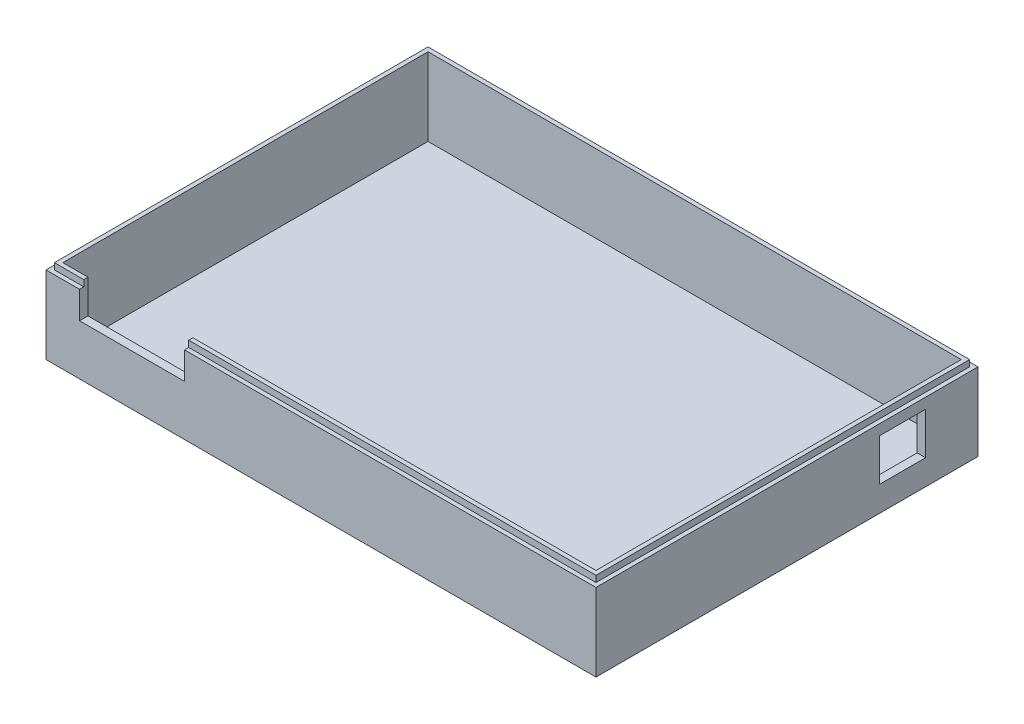
ISO-10303-21;
HEADER;
FILE_DESCRIPTION(('STEP AP214'),'2;1');
FILE_NAME('part.step','',(''),(''),'','','');
FILE_SCHEMA(('AUTOMOTIVE_DESIGN { 1 0 10303 214 1 1 1 1 }'));
ENDSEC;
DATA;
#1=APPLICATION_CONTEXT('core data for automotive mechanical design processes');
#2=APPLICATION_PROTOCOL_DEFINITION('international standard','automotive_design',2000,#1);
#3=PRODUCT_CONTEXT('',#1,'mechanical');
#4=PRODUCT('Part','Part','',(#3));
#5=PRODUCT_RELATED_PRODUCT_CATEGORY('part','',(#4));
#6=PRODUCT_DEFINITION_FORMATION('','',#4);
#7=PRODUCT_DEFINITION_CONTEXT('part definition',#1,'design');
#8=PRODUCT_DEFINITION('design','',#6,#7);
#9=PRODUCT_DEFINITION_SHAPE('','',#8);
#10=(LENGTH_UNIT() NAMED_UNIT(*) SI_UNIT(.MILLI.,.METRE.));
#11=(NAMED_UNIT(*) PLANE_ANGLE_UNIT() SI_UNIT($,.RADIAN.));
#12=(NAMED_UNIT(*) SI_UNIT($,.STERADIAN.) SOLID_ANGLE_UNIT());
#13=UNCERTAINTY_MEASURE_WITH_UNIT(LENGTH_MEASURE(1.E-05),#10,'distance_accuracy_value','');
#14=(GEOMETRIC_REPRESENTATION_CONTEXT(3) GLOBAL_UNCERTAINTY_ASSIGNED_CONTEXT((#13)) GLOBAL_UNIT_ASSIGNED_CONTEXT((#10,
#11,#12)) REPRESENTATION_CONTEXT('',''));
#15=CARTESIAN_POINT('',(0.,0.,0.));
#16=DIRECTION('',(0.,0.,1.));
#17=DIRECTION('',(1.,0.,0.));
#18=AXIS2_PLACEMENT_3D('',#15,#16,#17);
#19=CARTESIAN_POINT('',(65.5,20.,-45.5));
#20=DIRECTION('',(0.,0.,1.));
#21=DIRECTION('',(1.,0.,0.));
#22=AXIS2_PLACEMENT_3D('',#19,#20,#21);
#23=PLANE('',#22);
#24=DIRECTION('',(-1.,0.,0.));
#25=VECTOR('',#24,1.);
#26=CARTESIAN_POINT('',(65.5,18.5,-45.5));
#27=LINE('',#26,#25);
#28=CARTESIAN_POINT('',(65.5,18.5,-45.5));
#29=VERTEX_POINT('',#28);
#30=CARTESIAN_POINT('',(-65.5,18.5,-45.5));
#31=VERTEX_POINT('',#30);
#32=EDGE_CURVE('E359',#29,#31,#27,.T.);
#33=ORIENTED_EDGE('',*,*,#32,.F.);
#34=DIRECTION('',(0.,-1.,0.));
#35=VECTOR('',#34,1.);
#36=CARTESIAN_POINT('',(65.5,20.,-45.5));
#37=LINE('',#36,#35);
#38=CARTESIAN_POINT('',(65.5,0.,-45.5));
#39=VERTEX_POINT('',#38);
#40=EDGE_CURVE('E258',#29,#39,#37,.T.);
#41=ORIENTED_EDGE('',*,*,#40,.T.);
#42=DIRECTION('',(-1.,0.,0.));
#43=VECTOR('',#42,1.);
#44=CARTESIAN_POINT('',(65.5,0.,-45.5));
#45=LINE('',#44,#43);
#46=CARTESIAN_POINT('',(-65.5,0.,-45.5));
#47=VERTEX_POINT('',#46);
#48=EDGE_CURVE('E246',#39,#47,#45,.T.);
#49=ORIENTED_EDGE('',*,*,#48,.T.);
#50=DIRECTION('',(0.,-1.,0.));
#51=VECTOR('',#50,1.);
#52=CARTESIAN_POINT('',(-65.5,20.,-45.5));
#53=LINE('',#52,#51);
#54=EDGE_CURVE('E264',#31,#47,#53,.T.);
#55=ORIENTED_EDGE('',*,*,#54,.F.);
#56=EDGE_LOOP('',(#33,#41,#49,#55));
#57=FACE_BOUND('',#56,.T.);
#58=ADVANCED_FACE('F33',(#57),#23,.F.);
#59=CARTESIAN_POINT('',(-65.5,20.,-45.5));
#60=DIRECTION('',(1.,0.,0.));
#61=DIRECTION('',(0.,0.,-1.));
#62=AXIS2_PLACEMENT_3D('',#59,#60,#61);
#63=PLANE('',#62);
#64=DIRECTION('',(0.,0.,1.));
#65=VECTOR('',#64,1.);
#66=CARTESIAN_POINT('',(-65.5,18.5,-45.5));
#67=LINE('',#66,#65);
#68=CARTESIAN_POINT('',(-65.5,18.5,45.5));
#69=VERTEX_POINT('',#68);
#70=EDGE_CURVE('E189',#31,#69,#67,.T.);
#71=ORIENTED_EDGE('',*,*,#70,.F.);
#72=ORIENTED_EDGE('',*,*,#54,.T.);
#73=DIRECTION('',(0.,0.,1.));
#74=VECTOR('',#73,1.);
#75=CARTESIAN_POINT('',(-65.5,0.,-45.5));
#76=LINE('',#75,#74);
#77=CARTESIAN_POINT('',(-65.5,0.,45.5));
#78=VERTEX_POINT('',#77);
#79=EDGE_CURVE('E249',#47,#78,#76,.T.);
#80=ORIENTED_EDGE('',*,*,#79,.T.);
#81=DIRECTION('',(0.,-1.,0.));
#82=VECTOR('',#81,1.);
#83=CARTESIAN_POINT('',(-65.5,20.,45.5));
#84=LINE('',#83,#82);
#85=EDGE_CURVE('E262',#69,#78,#84,.T.);
#86=ORIENTED_EDGE('',*,*,#85,.F.);
#87=EDGE_LOOP('',(#71,#72,#80,#86));
#88=FACE_BOUND('',#87,.T.);
#89=ADVANCED_FACE('F408',(#88),#63,.F.);
#90=CARTESIAN_POINT('',(-65.5,20.,45.5));
#91=DIRECTION('',(0.,0.,-1.));
#92=DIRECTION('',(-1.,0.,0.));
#93=AXIS2_PLACEMENT_3D('',#90,#91,#92);
#94=PLANE('',#93);
#95=DIRECTION('',(1.,0.,0.));
#96=VECTOR('',#95,1.);
#97=CARTESIAN_POINT('',(-65.5,18.5,45.5));
#98=LINE('',#97,#96);
#99=CARTESIAN_POINT('',(-57.5,18.5,45.5));
#100=VERTEX_POINT('',#99);
#101=EDGE_CURVE('E182',#69,#100,#98,.T.);
#102=ORIENTED_EDGE('',*,*,#101,.F.);
#103=ORIENTED_EDGE('',*,*,#85,.T.);
#104=DIRECTION('',(1.,0.,0.));
#105=VECTOR('',#104,1.);
#106=CARTESIAN_POINT('',(-65.5,0.,45.5));
#107=LINE('',#106,#105);
#108=CARTESIAN_POINT('',(65.5,0.,45.5));
#109=VERTEX_POINT('',#108);
#110=EDGE_CURVE('E252',#78,#109,#107,.T.);
#111=ORIENTED_EDGE('',*,*,#110,.T.);
#112=DIRECTION('',(0.,-1.,0.));
#113=VECTOR('',#112,1.);
#114=CARTESIAN_POINT('',(65.5,20.,45.5));
#115=LINE('',#114,#113);
#116=CARTESIAN_POINT('',(65.5,18.5,45.5));
#117=VERTEX_POINT('',#116);
#118=EDGE_CURVE('E260',#117,#109,#115,.T.);
#119=ORIENTED_EDGE('',*,*,#118,.F.);
#120=DIRECTION('',(1.,0.,0.));
#121=VECTOR('',#120,1.);
#122=CARTESIAN_POINT('',(-32.5,18.5,45.5));
#123=LINE('',#122,#121);
#124=CARTESIAN_POINT('',(-32.5,18.5,45.5));
#125=VERTEX_POINT('',#124);
#126=EDGE_CURVE('E363',#125,#117,#123,.T.);
#127=ORIENTED_EDGE('',*,*,#126,.F.);
#128=DIRECTION('',(0.,1.,0.));
#129=VECTOR('',#128,1.);
#130=CARTESIAN_POINT('',(-32.5,22.,45.5));
#131=LINE('',#130,#129);
#132=CARTESIAN_POINT('',(-32.5,12.,45.5));
#133=VERTEX_POINT('',#132);
#134=EDGE_CURVE('E208',#133,#125,#131,.T.);
#135=ORIENTED_EDGE('',*,*,#134,.F.);
#136=DIRECTION('',(1.,0.,0.));
#137=VECTOR('',#136,1.);
#138=CARTESIAN_POINT('',(-57.5,12.,45.5));
#139=LINE('',#138,#137);
#140=CARTESIAN_POINT('',(-57.5,12.,45.5));
#141=VERTEX_POINT('',#140);
#142=EDGE_CURVE('E207',#141,#133,#139,.T.);
#143=ORIENTED_EDGE('',*,*,#142,.F.);
#144=DIRECTION('',(0.,-1.,0.));
#145=VECTOR('',#144,1.);
#146=CARTESIAN_POINT('',(-57.5,22.,45.5));
#147=LINE('',#146,#145);
#148=EDGE_CURVE('E199',#100,#141,#147,.T.);
#149=ORIENTED_EDGE('',*,*,#148,.F.);
#150=EDGE_LOOP('',(#102,#103,#111,#119,#127,#135,#143,#149));
#151=FACE_BOUND('',#150,.T.);
#152=ADVANCED_FACE('F205',(#151),#94,.F.);
#153=CARTESIAN_POINT('',(65.5,20.,45.5));
#154=DIRECTION('',(-1.,0.,0.));
#155=DIRECTION('',(0.,0.,1.));
#156=AXIS2_PLACEMENT_3D('',#153,#154,#155);
#157=PLANE('',#156);
#158=DIRECTION('',(0.,0.,1.));
#159=VECTOR('',#158,1.);
#160=CARTESIAN_POINT('',(65.5,16.,-22.));
#161=LINE('',#160,#159);
#162=CARTESIAN_POINT('',(65.5,16.,-33.));
#163=VERTEX_POINT('',#162);
#164=CARTESIAN_POINT('',(65.5,16.,-22.));
#165=VERTEX_POINT('',#164);
#166=EDGE_CURVE('E327',#163,#165,#161,.T.);
#167=ORIENTED_EDGE('',*,*,#166,.F.);
#168=DIRECTION('',(0.,1.,0.));
#169=VECTOR('',#168,1.);
#170=CARTESIAN_POINT('',(65.5,6.,-33.));
#171=LINE('',#170,#169);
#172=CARTESIAN_POINT('',(65.5,6.,-33.));
#173=VERTEX_POINT('',#172);
#174=EDGE_CURVE('E312',#173,#163,#171,.T.);
#175=ORIENTED_EDGE('',*,*,#174,.F.);
#176=DIRECTION('',(0.,0.,-1.));
#177=VECTOR('',#176,1.);
#178=CARTESIAN_POINT('',(65.5,6.,-22.));
#179=LINE('',#178,#177);
#180=CARTESIAN_POINT('',(65.5,6.,-22.));
#181=VERTEX_POINT('',#180);
#182=EDGE_CURVE('E294',#181,#173,#179,.T.);
#183=ORIENTED_EDGE('',*,*,#182,.F.);
#184=DIRECTION('',(0.,-1.,0.));
#185=VECTOR('',#184,1.);
#186=CARTESIAN_POINT('',(65.5,6.,-22.));
#187=LINE('',#186,#185);
#188=EDGE_CURVE('E329',#165,#181,#187,.T.);
#189=ORIENTED_EDGE('',*,*,#188,.F.);
#190=EDGE_LOOP('',(#167,#175,#183,#189));
#191=FACE_BOUND('',#190,.T.);
#192=DIRECTION('',(0.,0.,-1.));
#193=VECTOR('',#192,1.);
#194=CARTESIAN_POINT('',(65.5,18.5,45.5));
#195=LINE('',#194,#193);
#196=EDGE_CURVE('E361',#117,#29,#195,.T.);
#197=ORIENTED_EDGE('',*,*,#196,.F.);
#198=ORIENTED_EDGE('',*,*,#118,.T.);
#199=DIRECTION('',(0.,0.,-1.));
#200=VECTOR('',#199,1.);
#201=CARTESIAN_POINT('',(65.5,0.,45.5));
#202=LINE('',#201,#200);
#203=EDGE_CURVE('E255',#109,#39,#202,.T.);
#204=ORIENTED_EDGE('',*,*,#203,.T.);
#205=ORIENTED_EDGE('',*,*,#40,.F.);
#206=EDGE_LOOP('',(#197,#198,#204,#205));
#207=FACE_BOUND('',#206,.T.);
#208=ADVANCED_FACE('F400',(#191,#207),#157,.F.);
#209=CARTESIAN_POINT('',(0.,1.5,0.));
#210=DIRECTION('',(0.,-1.,0.));
#211=DIRECTION('',(0.,0.,-1.));
#212=AXIS2_PLACEMENT_3D('',#209,#210,#211);
#213=PLANE('',#212);
#214=DIRECTION('',(0.,0.,-1.));
#215=VECTOR('',#214,1.);
#216=CARTESIAN_POINT('',(63.5,1.5,43.5));
#217=LINE('',#216,#215);
#218=CARTESIAN_POINT('',(63.5,1.5,43.5));
#219=VERTEX_POINT('',#218);
#220=CARTESIAN_POINT('',(63.5,1.5,-43.5));
#221=VERTEX_POINT('',#220);
#222=EDGE_CURVE('E266',#219,#221,#217,.T.);
#223=ORIENTED_EDGE('',*,*,#222,.T.);
#224=DIRECTION('',(-1.,0.,0.));
#225=VECTOR('',#224,1.);
#226=CARTESIAN_POINT('',(-63.5,1.5,-43.5));
#227=LINE('',#226,#225);
#228=CARTESIAN_POINT('',(-63.5,1.5,-43.5));
#229=VERTEX_POINT('',#228);
#230=EDGE_CURVE('E269',#221,#229,#227,.T.);
#231=ORIENTED_EDGE('',*,*,#230,.T.);
#232=DIRECTION('',(0.,0.,1.));
#233=VECTOR('',#232,1.);
#234=CARTESIAN_POINT('',(-63.5,1.5,43.5));
#235=LINE('',#234,#233);
#236=CARTESIAN_POINT('',(-63.5,1.5,43.5));
#237=VERTEX_POINT('',#236);
#238=EDGE_CURVE('E41',#229,#237,#235,.T.);
#239=ORIENTED_EDGE('',*,*,#238,.T.);
#240=DIRECTION('',(1.,0.,0.));
#241=VECTOR('',#240,1.);
#242=CARTESIAN_POINT('',(-63.5,1.5,43.5));
#243=LINE('',#242,#241);
#244=EDGE_CURVE('E11',#237,#219,#243,.T.);
#245=ORIENTED_EDGE('',*,*,#244,.T.);
#246=EDGE_LOOP('',(#223,#231,#239,#245));
#247=FACE_BOUND('',#246,.T.);
#248=ADVANCED_FACE('F274',(#247),#213,.F.);
#249=CARTESIAN_POINT('',(-63.5,20.,-43.5));
#250=DIRECTION('',(1.,0.,0.));
#251=DIRECTION('',(0.,0.,-1.));
#252=AXIS2_PLACEMENT_3D('',#249,#250,#251);
#253=PLANE('',#252);
#254=ORIENTED_EDGE('',*,*,#238,.F.);
#255=DIRECTION('',(0.,-1.,0.));
#256=VECTOR('',#255,1.);
#257=CARTESIAN_POINT('',(-63.5,20.,-43.5));
#258=LINE('',#257,#256);
#259=CARTESIAN_POINT('',(-63.5,20.,-43.5));
#260=VERTEX_POINT('',#259);
#261=EDGE_CURVE('E235',#260,#229,#258,.T.);
#262=ORIENTED_EDGE('',*,*,#261,.F.);
#263=DIRECTION('',(0.,0.,1.));
#264=VECTOR('',#263,1.);
#265=CARTESIAN_POINT('',(-63.5,20.,-43.5));
#266=LINE('',#265,#264);
#267=CARTESIAN_POINT('',(-63.5,20.,43.5));
#268=VERTEX_POINT('',#267);
#269=EDGE_CURVE('E224',#260,#268,#266,.T.);
#270=ORIENTED_EDGE('',*,*,#269,.T.);
#271=DIRECTION('',(0.,-1.,0.));
#272=VECTOR('',#271,1.);
#273=CARTESIAN_POINT('',(-63.5,20.,43.5));
#274=LINE('',#273,#272);
#275=EDGE_CURVE('E243',#268,#237,#274,.T.);
#276=ORIENTED_EDGE('',*,*,#275,.T.);
#277=EDGE_LOOP('',(#254,#262,#270,#276));
#278=FACE_BOUND('',#277,.T.);
#279=ADVANCED_FACE('F277',(#278),#253,.T.);
#280=CARTESIAN_POINT('',(-63.5,20.,43.5));
#281=DIRECTION('',(0.,0.,-1.));
#282=DIRECTION('',(-1.,0.,0.));
#283=AXIS2_PLACEMENT_3D('',#280,#281,#282);
#284=PLANE('',#283);
#285=DIRECTION('',(0.,-1.,0.));
#286=VECTOR('',#285,1.);
#287=CARTESIAN_POINT('',(-57.5,22.,43.5));
#288=LINE('',#287,#286);
#289=CARTESIAN_POINT('',(-57.5,20.,43.5));
#290=VERTEX_POINT('',#289);
#291=CARTESIAN_POINT('',(-57.5,12.,43.5));
#292=VERTEX_POINT('',#291);
#293=EDGE_CURVE('E220',#290,#292,#288,.T.);
#294=ORIENTED_EDGE('',*,*,#293,.T.);
#295=DIRECTION('',(1.,0.,0.));
#296=VECTOR('',#295,1.);
#297=CARTESIAN_POINT('',(-57.5,12.,43.5));
#298=LINE('',#297,#296);
#299=CARTESIAN_POINT('',(-32.5,12.,43.5));
#300=VERTEX_POINT('',#299);
#301=EDGE_CURVE('E298',#292,#300,#298,.T.);
#302=ORIENTED_EDGE('',*,*,#301,.T.);
#303=DIRECTION('',(0.,1.,0.));
#304=VECTOR('',#303,1.);
#305=CARTESIAN_POINT('',(-32.5,22.,43.5));
#306=LINE('',#305,#304);
#307=CARTESIAN_POINT('',(-32.5,20.,43.5));
#308=VERTEX_POINT('',#307);
#309=EDGE_CURVE('E213',#300,#308,#306,.T.);
#310=ORIENTED_EDGE('',*,*,#309,.T.);
#311=DIRECTION('',(1.,0.,0.));
#312=VECTOR('',#311,1.);
#313=CARTESIAN_POINT('',(-63.5,20.,43.5));
#314=LINE('',#313,#312);
#315=CARTESIAN_POINT('',(63.5,20.,43.5));
#316=VERTEX_POINT('',#315);
#317=EDGE_CURVE('E226',#308,#316,#314,.T.);
#318=ORIENTED_EDGE('',*,*,#317,.T.);
#319=DIRECTION('',(0.,-1.,0.));
#320=VECTOR('',#319,1.);
#321=CARTESIAN_POINT('',(63.5,20.,43.5));
#322=LINE('',#321,#320);
#323=EDGE_CURVE('E240',#316,#219,#322,.T.);
#324=ORIENTED_EDGE('',*,*,#323,.T.);
#325=ORIENTED_EDGE('',*,*,#244,.F.);
#326=ORIENTED_EDGE('',*,*,#275,.F.);
#327=EDGE_CURVE('E227',#268,#290,#314,.T.);
#328=ORIENTED_EDGE('',*,*,#327,.T.);
#329=EDGE_LOOP('',(#294,#302,#310,#318,#324,#325,#326,#328));
#330=FACE_BOUND('',#329,.T.);
#331=ADVANCED_FACE('F282',(#330),#284,.T.);
#332=CARTESIAN_POINT('',(63.5,20.,43.5));
#333=DIRECTION('',(-1.,0.,0.));
#334=DIRECTION('',(0.,0.,1.));
#335=AXIS2_PLACEMENT_3D('',#332,#333,#334);
#336=PLANE('',#335);
#337=DIRECTION('',(0.,1.,0.));
#338=VECTOR('',#337,1.);
#339=CARTESIAN_POINT('',(63.5,6.,-33.));
#340=LINE('',#339,#338);
#341=CARTESIAN_POINT('',(63.5,6.,-33.));
#342=VERTEX_POINT('',#341);
#343=CARTESIAN_POINT('',(63.5,16.,-33.));
#344=VERTEX_POINT('',#343);
#345=EDGE_CURVE('E310',#342,#344,#340,.T.);
#346=ORIENTED_EDGE('',*,*,#345,.T.);
#347=DIRECTION('',(0.,0.,1.));
#348=VECTOR('',#347,1.);
#349=CARTESIAN_POINT('',(63.5,16.,-22.));
#350=LINE('',#349,#348);
#351=CARTESIAN_POINT('',(63.5,16.,-22.));
#352=VERTEX_POINT('',#351);
#353=EDGE_CURVE('E313',#344,#352,#350,.T.);
#354=ORIENTED_EDGE('',*,*,#353,.T.);
#355=DIRECTION('',(0.,-1.,0.));
#356=VECTOR('',#355,1.);
#357=CARTESIAN_POINT('',(63.5,6.,-22.));
#358=LINE('',#357,#356);
#359=CARTESIAN_POINT('',(63.5,6.,-22.));
#360=VERTEX_POINT('',#359);
#361=EDGE_CURVE('E316',#352,#360,#358,.T.);
#362=ORIENTED_EDGE('',*,*,#361,.T.);
#363=DIRECTION('',(0.,0.,-1.));
#364=VECTOR('',#363,1.);
#365=CARTESIAN_POINT('',(63.5,6.,-22.));
#366=LINE('',#365,#364);
#367=EDGE_CURVE('E309',#360,#342,#366,.T.);
#368=ORIENTED_EDGE('',*,*,#367,.T.);
#369=EDGE_LOOP('',(#346,#354,#362,#368));
#370=FACE_BOUND('',#369,.T.);
#371=ORIENTED_EDGE('',*,*,#222,.F.);
#372=ORIENTED_EDGE('',*,*,#323,.F.);
#373=DIRECTION('',(0.,0.,-1.));
#374=VECTOR('',#373,1.);
#375=CARTESIAN_POINT('',(63.5,20.,43.5));
#376=LINE('',#375,#374);
#377=CARTESIAN_POINT('',(63.5,20.,-43.5));
#378=VERTEX_POINT('',#377);
#379=EDGE_CURVE('E230',#316,#378,#376,.T.);
#380=ORIENTED_EDGE('',*,*,#379,.T.);
#381=DIRECTION('',(0.,-1.,0.));
#382=VECTOR('',#381,1.);
#383=CARTESIAN_POINT('',(63.5,20.,-43.5));
#384=LINE('',#383,#382);
#385=EDGE_CURVE('E237',#378,#221,#384,.T.);
#386=ORIENTED_EDGE('',*,*,#385,.T.);
#387=EDGE_LOOP('',(#371,#372,#380,#386));
#388=FACE_BOUND('',#387,.T.);
#389=ADVANCED_FACE('F441',(#370,#388),#336,.T.);
#390=CARTESIAN_POINT('',(63.5,20.,-43.5));
#391=DIRECTION('',(0.,0.,1.));
#392=DIRECTION('',(1.,0.,0.));
#393=AXIS2_PLACEMENT_3D('',#390,#391,#392);
#394=PLANE('',#393);
#395=ORIENTED_EDGE('',*,*,#230,.F.);
#396=ORIENTED_EDGE('',*,*,#385,.F.);
#397=DIRECTION('',(-1.,0.,0.));
#398=VECTOR('',#397,1.);
#399=CARTESIAN_POINT('',(63.5,20.,-43.5));
#400=LINE('',#399,#398);
#401=EDGE_CURVE('E233',#378,#260,#400,.T.);
#402=ORIENTED_EDGE('',*,*,#401,.T.);
#403=ORIENTED_EDGE('',*,*,#261,.T.);
#404=EDGE_LOOP('',(#395,#396,#402,#403));
#405=FACE_BOUND('',#404,.T.);
#406=ADVANCED_FACE('F417',(#405),#394,.T.);
#407=CARTESIAN_POINT('',(0.,20.,0.));
#408=DIRECTION('',(0.,1.,0.));
#409=DIRECTION('',(0.,0.,1.));
#410=AXIS2_PLACEMENT_3D('',#407,#408,#409);
#411=PLANE('',#410);
#412=DIRECTION('',(-1.,0.,0.));
#413=VECTOR('',#412,1.);
#414=CARTESIAN_POINT('',(64.5,20.,44.5));
#415=LINE('',#414,#413);
#416=CARTESIAN_POINT('',(64.5,20.,44.5));
#417=VERTEX_POINT('',#416);
#418=CARTESIAN_POINT('',(-32.5,20.,44.5));
#419=VERTEX_POINT('',#418);
#420=EDGE_CURVE('E193',#417,#419,#415,.T.);
#421=ORIENTED_EDGE('',*,*,#420,.F.);
#422=DIRECTION('',(0.,0.,1.));
#423=VECTOR('',#422,1.);
#424=CARTESIAN_POINT('',(64.5,20.,-44.5));
#425=LINE('',#424,#423);
#426=CARTESIAN_POINT('',(64.5,20.,-44.5));
#427=VERTEX_POINT('',#426);
#428=EDGE_CURVE('E348',#427,#417,#425,.T.);
#429=ORIENTED_EDGE('',*,*,#428,.F.);
#430=DIRECTION('',(1.,0.,0.));
#431=VECTOR('',#430,1.);
#432=CARTESIAN_POINT('',(-64.5,20.,-44.5));
#433=LINE('',#432,#431);
#434=CARTESIAN_POINT('',(-64.5,20.,-44.5));
#435=VERTEX_POINT('',#434);
#436=EDGE_CURVE('E351',#435,#427,#433,.T.);
#437=ORIENTED_EDGE('',*,*,#436,.F.);
#438=DIRECTION('',(0.,0.,-1.));
#439=VECTOR('',#438,1.);
#440=CARTESIAN_POINT('',(-64.5,20.,44.5));
#441=LINE('',#440,#439);
#442=CARTESIAN_POINT('',(-64.5,20.,44.5));
#443=VERTEX_POINT('',#442);
#444=EDGE_CURVE('E354',#443,#435,#441,.T.);
#445=ORIENTED_EDGE('',*,*,#444,.F.);
#446=DIRECTION('',(-1.,0.,0.));
#447=VECTOR('',#446,1.);
#448=CARTESIAN_POINT('',(-57.5,20.,44.5));
#449=LINE('',#448,#447);
#450=CARTESIAN_POINT('',(-57.5,20.,44.5));
#451=VERTEX_POINT('',#450);
#452=EDGE_CURVE('E292',#451,#443,#449,.T.);
#453=ORIENTED_EDGE('',*,*,#452,.F.);
#454=DIRECTION('',(0.,0.,-1.));
#455=VECTOR('',#454,1.);
#456=CARTESIAN_POINT('',(-57.5,20.,-45.501));
#457=LINE('',#456,#455);
#458=EDGE_CURVE('E288',#451,#290,#457,.T.);
#459=ORIENTED_EDGE('',*,*,#458,.T.);
#460=ORIENTED_EDGE('',*,*,#327,.F.);
#461=ORIENTED_EDGE('',*,*,#269,.F.);
#462=ORIENTED_EDGE('',*,*,#401,.F.);
#463=ORIENTED_EDGE('',*,*,#379,.F.);
#464=ORIENTED_EDGE('',*,*,#317,.F.);
#465=DIRECTION('',(0.,0.,1.));
#466=VECTOR('',#465,1.);
#467=CARTESIAN_POINT('',(-32.5,20.,-45.501));
#468=LINE('',#467,#466);
#469=EDGE_CURVE('E293',#308,#419,#468,.T.);
#470=ORIENTED_EDGE('',*,*,#469,.T.);
#471=EDGE_LOOP('',(#421,#429,#437,#445,#453,#459,#460,#461,#462,#463,#464,#470));
#472=FACE_BOUND('',#471,.T.);
#473=ADVANCED_FACE('F285',(#472),#411,.T.);
#474=CARTESIAN_POINT('',(0.,0.,0.));
#475=DIRECTION('',(0.,-1.,0.));
#476=DIRECTION('',(0.,0.,-1.));
#477=AXIS2_PLACEMENT_3D('',#474,#475,#476);
#478=PLANE('',#477);
#479=ORIENTED_EDGE('',*,*,#48,.F.);
#480=ORIENTED_EDGE('',*,*,#203,.F.);
#481=ORIENTED_EDGE('',*,*,#110,.F.);
#482=ORIENTED_EDGE('',*,*,#79,.F.);
#483=EDGE_LOOP('',(#479,#480,#481,#482));
#484=FACE_BOUND('',#483,.T.);
#485=ADVANCED_FACE('F35',(#484),#478,.T.);
#486=CARTESIAN_POINT('',(-57.5,22.,-45.501));
#487=DIRECTION('',(-1.,0.,0.));
#488=DIRECTION('',(0.,0.,1.));
#489=AXIS2_PLACEMENT_3D('',#486,#487,#488);
#490=PLANE('',#489);
#491=ORIENTED_EDGE('',*,*,#458,.F.);
#492=DIRECTION('',(0.,1.,0.));
#493=VECTOR('',#492,1.);
#494=CARTESIAN_POINT('',(-57.5,18.5,44.5));
#495=LINE('',#494,#493);
#496=CARTESIAN_POINT('',(-57.5,18.5,44.5));
#497=VERTEX_POINT('',#496);
#498=EDGE_CURVE('E201',#497,#451,#495,.T.);
#499=ORIENTED_EDGE('',*,*,#498,.F.);
#500=DIRECTION('',(0.,0.,-1.));
#501=VECTOR('',#500,1.);
#502=CARTESIAN_POINT('',(-57.5,18.5,45.5));
#503=LINE('',#502,#501);
#504=EDGE_CURVE('E186',#100,#497,#503,.T.);
#505=ORIENTED_EDGE('',*,*,#504,.F.);
#506=ORIENTED_EDGE('',*,*,#148,.T.);
#507=DIRECTION('',(0.,0.,1.));
#508=VECTOR('',#507,1.);
#509=CARTESIAN_POINT('',(-57.5,12.,-45.501));
#510=LINE('',#509,#508);
#511=EDGE_CURVE('E210',#292,#141,#510,.T.);
#512=ORIENTED_EDGE('',*,*,#511,.F.);
#513=ORIENTED_EDGE('',*,*,#293,.F.);
#514=EDGE_LOOP('',(#491,#499,#505,#506,#512,#513));
#515=FACE_BOUND('',#514,.T.);
#516=ADVANCED_FACE('F197',(#515),#490,.F.);
#517=CARTESIAN_POINT('',(-57.5,12.,-45.501));
#518=DIRECTION('',(0.,-1.,0.));
#519=DIRECTION('',(0.,0.,-1.));
#520=AXIS2_PLACEMENT_3D('',#517,#518,#519);
#521=PLANE('',#520);
#522=ORIENTED_EDGE('',*,*,#511,.T.);
#523=ORIENTED_EDGE('',*,*,#142,.T.);
#524=DIRECTION('',(0.,0.,1.));
#525=VECTOR('',#524,1.);
#526=CARTESIAN_POINT('',(-32.5,12.,-45.501));
#527=LINE('',#526,#525);
#528=EDGE_CURVE('E217',#300,#133,#527,.T.);
#529=ORIENTED_EDGE('',*,*,#528,.F.);
#530=ORIENTED_EDGE('',*,*,#301,.F.);
#531=EDGE_LOOP('',(#522,#523,#529,#530));
#532=FACE_BOUND('',#531,.T.);
#533=ADVANCED_FACE('F415',(#532),#521,.F.);
#534=CARTESIAN_POINT('',(-32.5,22.,-45.501));
#535=DIRECTION('',(1.,0.,0.));
#536=DIRECTION('',(0.,0.,-1.));
#537=AXIS2_PLACEMENT_3D('',#534,#535,#536);
#538=PLANE('',#537);
#539=DIRECTION('',(0.,0.,1.));
#540=VECTOR('',#539,1.);
#541=CARTESIAN_POINT('',(-32.5,18.5,44.5));
#542=LINE('',#541,#540);
#543=CARTESIAN_POINT('',(-32.5,18.5,44.5));
#544=VERTEX_POINT('',#543);
#545=EDGE_CURVE('E365',#544,#125,#542,.T.);
#546=ORIENTED_EDGE('',*,*,#545,.F.);
#547=DIRECTION('',(0.,1.,0.));
#548=VECTOR('',#547,1.);
#549=CARTESIAN_POINT('',(-32.5,18.5,44.5));
#550=LINE('',#549,#548);
#551=EDGE_CURVE('E325',#544,#419,#550,.T.);
#552=ORIENTED_EDGE('',*,*,#551,.T.);
#553=ORIENTED_EDGE('',*,*,#469,.F.);
#554=ORIENTED_EDGE('',*,*,#309,.F.);
#555=ORIENTED_EDGE('',*,*,#528,.T.);
#556=ORIENTED_EDGE('',*,*,#134,.T.);
#557=EDGE_LOOP('',(#546,#552,#553,#554,#555,#556));
#558=FACE_BOUND('',#557,.T.);
#559=ADVANCED_FACE('F393',(#558),#538,.F.);
#560=CARTESIAN_POINT('',(-65.501,6.,-33.));
#561=DIRECTION('',(0.,0.,-1.));
#562=DIRECTION('',(-1.,0.,0.));
#563=AXIS2_PLACEMENT_3D('',#560,#561,#562);
#564=PLANE('',#563);
#565=DIRECTION('',(1.,0.,0.));
#566=VECTOR('',#565,1.);
#567=CARTESIAN_POINT('',(-65.501,6.,-33.));
#568=LINE('',#567,#566);
#569=EDGE_CURVE('E317',#342,#173,#568,.T.);
#570=ORIENTED_EDGE('',*,*,#569,.T.);
#571=ORIENTED_EDGE('',*,*,#174,.T.);
#572=DIRECTION('',(1.,0.,0.));
#573=VECTOR('',#572,1.);
#574=CARTESIAN_POINT('',(-65.501,16.,-33.));
#575=LINE('',#574,#573);
#576=EDGE_CURVE('E306',#344,#163,#575,.T.);
#577=ORIENTED_EDGE('',*,*,#576,.F.);
#578=ORIENTED_EDGE('',*,*,#345,.F.);
#579=EDGE_LOOP('',(#570,#571,#577,#578));
#580=FACE_BOUND('',#579,.T.);
#581=ADVANCED_FACE('F449',(#580),#564,.F.);
#582=CARTESIAN_POINT('',(-65.501,6.,-22.));
#583=DIRECTION('',(0.,-1.,0.));
#584=DIRECTION('',(0.,0.,-1.));
#585=AXIS2_PLACEMENT_3D('',#582,#583,#584);
#586=PLANE('',#585);
#587=DIRECTION('',(1.,0.,0.));
#588=VECTOR('',#587,1.);
#589=CARTESIAN_POINT('',(-65.501,6.,-22.));
#590=LINE('',#589,#588);
#591=EDGE_CURVE('E314',#360,#181,#590,.T.);
#592=ORIENTED_EDGE('',*,*,#591,.T.);
#593=ORIENTED_EDGE('',*,*,#182,.T.);
#594=ORIENTED_EDGE('',*,*,#569,.F.);
#595=ORIENTED_EDGE('',*,*,#367,.F.);
#596=EDGE_LOOP('',(#592,#593,#594,#595));
#597=FACE_BOUND('',#596,.T.);
#598=ADVANCED_FACE('F455',(#597),#586,.F.);
#599=CARTESIAN_POINT('',(-65.501,6.,-22.));
#600=DIRECTION('',(0.,0.,1.));
#601=DIRECTION('',(1.,0.,0.));
#602=AXIS2_PLACEMENT_3D('',#599,#600,#601);
#603=PLANE('',#602);
#604=DIRECTION('',(1.,0.,0.));
#605=VECTOR('',#604,1.);
#606=CARTESIAN_POINT('',(-65.501,16.,-22.));
#607=LINE('',#606,#605);
#608=EDGE_CURVE('E56',#352,#165,#607,.T.);
#609=ORIENTED_EDGE('',*,*,#608,.T.);
#610=ORIENTED_EDGE('',*,*,#188,.T.);
#611=ORIENTED_EDGE('',*,*,#591,.F.);
#612=ORIENTED_EDGE('',*,*,#361,.F.);
#613=EDGE_LOOP('',(#609,#610,#611,#612));
#614=FACE_BOUND('',#613,.T.);
#615=ADVANCED_FACE('F459',(#614),#603,.F.);
#616=CARTESIAN_POINT('',(-65.501,16.,-22.));
#617=DIRECTION('',(0.,1.,0.));
#618=DIRECTION('',(0.,0.,1.));
#619=AXIS2_PLACEMENT_3D('',#616,#617,#618);
#620=PLANE('',#619);
#621=ORIENTED_EDGE('',*,*,#576,.T.);
#622=ORIENTED_EDGE('',*,*,#166,.T.);
#623=ORIENTED_EDGE('',*,*,#608,.F.);
#624=ORIENTED_EDGE('',*,*,#353,.F.);
#625=EDGE_LOOP('',(#621,#622,#623,#624));
#626=FACE_BOUND('',#625,.T.);
#627=ADVANCED_FACE('F463',(#626),#620,.F.);
#628=CARTESIAN_POINT('',(64.5,18.5,44.5));
#629=DIRECTION('',(0.,0.,-1.));
#630=DIRECTION('',(-1.,0.,0.));
#631=AXIS2_PLACEMENT_3D('',#628,#629,#630);
#632=PLANE('',#631);
#633=ORIENTED_EDGE('',*,*,#420,.T.);
#634=ORIENTED_EDGE('',*,*,#551,.F.);
#635=DIRECTION('',(-1.,0.,0.));
#636=VECTOR('',#635,1.);
#637=CARTESIAN_POINT('',(64.5,18.5,44.5));
#638=LINE('',#637,#636);
#639=CARTESIAN_POINT('',(64.5,18.5,44.5));
#640=VERTEX_POINT('',#639);
#641=EDGE_CURVE('E48',#640,#544,#638,.T.);
#642=ORIENTED_EDGE('',*,*,#641,.F.);
#643=DIRECTION('',(0.,1.,0.));
#644=VECTOR('',#643,1.);
#645=CARTESIAN_POINT('',(64.5,18.5,44.5));
#646=LINE('',#645,#644);
#647=EDGE_CURVE('E343',#640,#417,#646,.T.);
#648=ORIENTED_EDGE('',*,*,#647,.T.);
#649=EDGE_LOOP('',(#633,#634,#642,#648));
#650=FACE_BOUND('',#649,.T.);
#651=ADVANCED_FACE('F390',(#650),#632,.F.);
#652=CARTESIAN_POINT('',(64.5,18.5,-44.5));
#653=DIRECTION('',(-1.,0.,0.));
#654=DIRECTION('',(0.,0.,1.));
#655=AXIS2_PLACEMENT_3D('',#652,#653,#654);
#656=PLANE('',#655);
#657=ORIENTED_EDGE('',*,*,#428,.T.);
#658=ORIENTED_EDGE('',*,*,#647,.F.);
#659=DIRECTION('',(0.,0.,1.));
#660=VECTOR('',#659,1.);
#661=CARTESIAN_POINT('',(64.5,18.5,-44.5));
#662=LINE('',#661,#660);
#663=CARTESIAN_POINT('',(64.5,18.5,-44.5));
#664=VERTEX_POINT('',#663);
#665=EDGE_CURVE('E368',#664,#640,#662,.T.);
#666=ORIENTED_EDGE('',*,*,#665,.F.);
#667=DIRECTION('',(0.,1.,0.));
#668=VECTOR('',#667,1.);
#669=CARTESIAN_POINT('',(64.5,18.5,-44.5));
#670=LINE('',#669,#668);
#671=EDGE_CURVE('E341',#664,#427,#670,.T.);
#672=ORIENTED_EDGE('',*,*,#671,.T.);
#673=EDGE_LOOP('',(#657,#658,#666,#672));
#674=FACE_BOUND('',#673,.T.);
#675=ADVANCED_FACE('F387',(#674),#656,.F.);
#676=CARTESIAN_POINT('',(-64.5,18.5,-44.5));
#677=DIRECTION('',(0.,0.,1.));
#678=DIRECTION('',(1.,0.,0.));
#679=AXIS2_PLACEMENT_3D('',#676,#677,#678);
#680=PLANE('',#679);
#681=ORIENTED_EDGE('',*,*,#436,.T.);
#682=ORIENTED_EDGE('',*,*,#671,.F.);
#683=DIRECTION('',(1.,0.,0.));
#684=VECTOR('',#683,1.);
#685=CARTESIAN_POINT('',(-64.5,18.5,-44.5));
#686=LINE('',#685,#684);
#687=CARTESIAN_POINT('',(-64.5,18.5,-44.5));
#688=VERTEX_POINT('',#687);
#689=EDGE_CURVE('E370',#688,#664,#686,.T.);
#690=ORIENTED_EDGE('',*,*,#689,.F.);
#691=DIRECTION('',(0.,1.,0.));
#692=VECTOR('',#691,1.);
#693=CARTESIAN_POINT('',(-64.5,18.5,-44.5));
#694=LINE('',#693,#692);
#695=EDGE_CURVE('E339',#688,#435,#694,.T.);
#696=ORIENTED_EDGE('',*,*,#695,.T.);
#697=EDGE_LOOP('',(#681,#682,#690,#696));
#698=FACE_BOUND('',#697,.T.);
#699=ADVANCED_FACE('F384',(#698),#680,.F.);
#700=CARTESIAN_POINT('',(-64.5,18.5,44.5));
#701=DIRECTION('',(1.,0.,0.));
#702=DIRECTION('',(0.,0.,-1.));
#703=AXIS2_PLACEMENT_3D('',#700,#701,#702);
#704=PLANE('',#703);
#705=ORIENTED_EDGE('',*,*,#444,.T.);
#706=ORIENTED_EDGE('',*,*,#695,.F.);
#707=DIRECTION('',(0.,0.,-1.));
#708=VECTOR('',#707,1.);
#709=CARTESIAN_POINT('',(-64.5,18.5,44.5));
#710=LINE('',#709,#708);
#711=CARTESIAN_POINT('',(-64.5,18.5,44.5));
#712=VERTEX_POINT('',#711);
#713=EDGE_CURVE('E373',#712,#688,#710,.T.);
#714=ORIENTED_EDGE('',*,*,#713,.F.);
#715=DIRECTION('',(0.,1.,0.));
#716=VECTOR('',#715,1.);
#717=CARTESIAN_POINT('',(-64.5,18.5,44.5));
#718=LINE('',#717,#716);
#719=EDGE_CURVE('E337',#712,#443,#718,.T.);
#720=ORIENTED_EDGE('',*,*,#719,.T.);
#721=EDGE_LOOP('',(#705,#706,#714,#720));
#722=FACE_BOUND('',#721,.T.);
#723=ADVANCED_FACE('F380',(#722),#704,.F.);
#724=CARTESIAN_POINT('',(-57.5,18.5,44.5));
#725=DIRECTION('',(0.,0.,-1.));
#726=DIRECTION('',(-1.,0.,0.));
#727=AXIS2_PLACEMENT_3D('',#724,#725,#726);
#728=PLANE('',#727);
#729=ORIENTED_EDGE('',*,*,#452,.T.);
#730=ORIENTED_EDGE('',*,*,#719,.F.);
#731=DIRECTION('',(-1.,0.,0.));
#732=VECTOR('',#731,1.);
#733=CARTESIAN_POINT('',(-57.5,18.5,44.5));
#734=LINE('',#733,#732);
#735=EDGE_CURVE('E202',#497,#712,#734,.T.);
#736=ORIENTED_EDGE('',*,*,#735,.F.);
#737=ORIENTED_EDGE('',*,*,#498,.T.);
#738=EDGE_LOOP('',(#729,#730,#736,#737));
#739=FACE_BOUND('',#738,.T.);
#740=ADVANCED_FACE('F378',(#739),#728,.F.);
#741=CARTESIAN_POINT('',(0.,18.5,0.));
#742=DIRECTION('',(0.,1.,0.));
#743=DIRECTION('',(0.,0.,1.));
#744=AXIS2_PLACEMENT_3D('',#741,#742,#743);
#745=PLANE('',#744);
#746=ORIENTED_EDGE('',*,*,#101,.T.);
#747=ORIENTED_EDGE('',*,*,#504,.T.);
#748=ORIENTED_EDGE('',*,*,#735,.T.);
#749=ORIENTED_EDGE('',*,*,#713,.T.);
#750=ORIENTED_EDGE('',*,*,#689,.T.);
#751=ORIENTED_EDGE('',*,*,#665,.T.);
#752=ORIENTED_EDGE('',*,*,#641,.T.);
#753=ORIENTED_EDGE('',*,*,#545,.T.);
#754=ORIENTED_EDGE('',*,*,#126,.T.);
#755=ORIENTED_EDGE('',*,*,#196,.T.);
#756=ORIENTED_EDGE('',*,*,#32,.T.);
#757=ORIENTED_EDGE('',*,*,#70,.T.);
#758=EDGE_LOOP('',(#746,#747,#748,#749,#750,#751,#752,#753,#754,#755,#756,#757));
#759=FACE_BOUND('',#758,.T.);
#760=ADVANCED_FACE('F184',(#759),#745,.T.);
#761=CLOSED_SHELL('',(#58,#89,#152,#208,#248,#279,#331,#389,#406,#473,#485,#516,#533,#559,#581,
#598,#615,#627,#651,#675,#699,#723,#740,#760));
#762=MANIFOLD_SOLID_BREP('B2',#761);
#763=ADVANCED_BREP_SHAPE_REPRESENTATION('',(#18,#762),#14);
#764=SHAPE_DEFINITION_REPRESENTATION(#9,#763);
ENDSEC;
END-ISO-10303-21;
